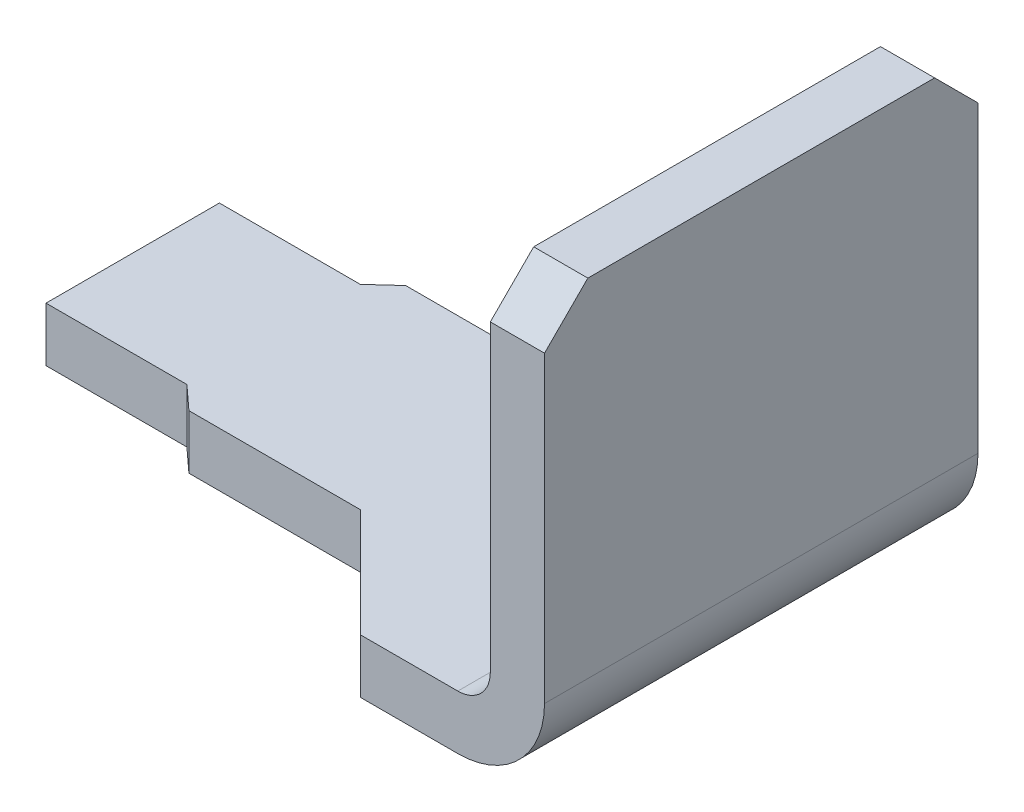
ISO-10303-21;
HEADER;
FILE_DESCRIPTION(('STEP AP214'),'2;1');
FILE_NAME('part.step','',(''),(''),'','','');
FILE_SCHEMA(('AUTOMOTIVE_DESIGN { 1 0 10303 214 1 1 1 1 }'));
ENDSEC;
DATA;
#1=APPLICATION_CONTEXT('core data for automotive mechanical design processes');
#2=APPLICATION_PROTOCOL_DEFINITION('international standard','automotive_design',2000,#1);
#3=PRODUCT_CONTEXT('',#1,'mechanical');
#4=PRODUCT('Part','Part','',(#3));
#5=PRODUCT_RELATED_PRODUCT_CATEGORY('part','',(#4));
#6=PRODUCT_DEFINITION_FORMATION('','',#4);
#7=PRODUCT_DEFINITION_CONTEXT('part definition',#1,'design');
#8=PRODUCT_DEFINITION('design','',#6,#7);
#9=PRODUCT_DEFINITION_SHAPE('','',#8);
#10=(LENGTH_UNIT() NAMED_UNIT(*) SI_UNIT(.MILLI.,.METRE.));
#11=(NAMED_UNIT(*) PLANE_ANGLE_UNIT() SI_UNIT($,.RADIAN.));
#12=(NAMED_UNIT(*) SI_UNIT($,.STERADIAN.) SOLID_ANGLE_UNIT());
#13=UNCERTAINTY_MEASURE_WITH_UNIT(LENGTH_MEASURE(1.E-05),#10,'distance_accuracy_value','');
#14=(GEOMETRIC_REPRESENTATION_CONTEXT(3) GLOBAL_UNCERTAINTY_ASSIGNED_CONTEXT((#13)) GLOBAL_UNIT_ASSIGNED_CONTEXT((#10,
#11,#12)) REPRESENTATION_CONTEXT('',''));
#15=CARTESIAN_POINT('',(0.,0.,0.));
#16=DIRECTION('',(0.,0.,1.));
#17=DIRECTION('',(1.,0.,0.));
#18=AXIS2_PLACEMENT_3D('',#15,#16,#17);
#19=CARTESIAN_POINT('',(9.7,-1.35,-2.84));
#20=DIRECTION('',(0.,-1.,0.));
#21=DIRECTION('',(1.,0.,0.));
#22=AXIS2_PLACEMENT_3D('',#19,#20,#21);
#23=PLANE('',#22);
#24=DIRECTION('',(-1.,0.,0.));
#25=VECTOR('',#24,1.);
#26=CARTESIAN_POINT('',(11.,-1.35,-1.3));
#27=LINE('',#26,#25);
#28=CARTESIAN_POINT('',(10.5094755956487,-1.35,-1.3));
#29=VERTEX_POINT('',#28);
#30=CARTESIAN_POINT('',(11.2999999999995,-1.35,-1.3));
#31=VERTEX_POINT('',#30);
#32=EDGE_CURVE('E210',#29,#31,#27,.F.);
#33=ORIENTED_EDGE('',*,*,#32,.F.);
#34=DIRECTION('',(-0.738337641397567,0.,-0.674431262098279));
#35=VECTOR('',#34,1.);
#36=CARTESIAN_POINT('',(10.53436098737,-1.35,-1.277268548688));
#37=LINE('',#36,#35);
#38=CARTESIAN_POINT('',(10.4000000000019,-1.35,-1.40000000000063));
#39=VERTEX_POINT('',#38);
#40=EDGE_CURVE('E211',#39,#29,#37,.F.);
#41=ORIENTED_EDGE('',*,*,#40,.F.);
#42=DIRECTION('',(-1.,0.,0.));
#43=VECTOR('',#42,1.);
#44=CARTESIAN_POINT('',(11.,-1.35,-1.4));
#45=LINE('',#44,#43);
#46=CARTESIAN_POINT('',(9.75,-1.35,-1.4));
#47=VERTEX_POINT('',#46);
#48=EDGE_CURVE('E212',#47,#39,#45,.F.);
#49=ORIENTED_EDGE('',*,*,#48,.F.);
#50=DIRECTION('',(0.,0.,-1.));
#51=VECTOR('',#50,1.);
#52=CARTESIAN_POINT('',(9.75,-1.35,-1.8));
#53=LINE('',#52,#51);
#54=CARTESIAN_POINT('',(9.75,-1.35,-2.2));
#55=VERTEX_POINT('',#54);
#56=EDGE_CURVE('E218',#55,#47,#53,.F.);
#57=ORIENTED_EDGE('',*,*,#56,.F.);
#58=DIRECTION('',(1.,0.,0.));
#59=VECTOR('',#58,1.);
#60=CARTESIAN_POINT('',(11.,-1.35,-2.2));
#61=LINE('',#60,#59);
#62=CARTESIAN_POINT('',(10.4000000000019,-1.35,-2.19999999999937));
#63=VERTEX_POINT('',#62);
#64=EDGE_CURVE('E168',#63,#55,#61,.F.);
#65=ORIENTED_EDGE('',*,*,#64,.F.);
#66=DIRECTION('',(0.738337641397565,0.,-0.674431262098281));
#67=VECTOR('',#66,1.);
#68=CARTESIAN_POINT('',(10.37511460828,-1.35,-2.177268548688));
#69=LINE('',#68,#67);
#70=CARTESIAN_POINT('',(10.5094755956487,-1.35,-2.3));
#71=VERTEX_POINT('',#70);
#72=EDGE_CURVE('E166',#71,#63,#69,.F.);
#73=ORIENTED_EDGE('',*,*,#72,.F.);
#74=DIRECTION('',(1.,0.,0.));
#75=VECTOR('',#74,1.);
#76=CARTESIAN_POINT('',(11.,-1.35,-2.3));
#77=LINE('',#76,#75);
#78=CARTESIAN_POINT('',(11.2999999999993,-1.35,-2.30000000000023));
#79=VERTEX_POINT('',#78);
#80=EDGE_CURVE('E153',#79,#71,#77,.F.);
#81=ORIENTED_EDGE('',*,*,#80,.F.);
#82=DIRECTION('',(0.707106781187841,0.,-0.707106781185254));
#83=VECTOR('',#82,1.);
#84=CARTESIAN_POINT('',(11.27616723264,-1.35,-2.276167232641));
#85=LINE('',#84,#83);
#86=CARTESIAN_POINT('',(11.8000000000005,-1.35,-2.8));
#87=VERTEX_POINT('',#86);
#88=EDGE_CURVE('E20',#87,#79,#85,.F.);
#89=ORIENTED_EDGE('',*,*,#88,.F.);
#90=DIRECTION('',(1.,0.,0.));
#91=VECTOR('',#90,1.);
#92=CARTESIAN_POINT('',(11.,-1.35,-2.8));
#93=LINE('',#92,#91);
#94=CARTESIAN_POINT('',(12.25,-1.35,-2.8));
#95=VERTEX_POINT('',#94);
#96=EDGE_CURVE('E139',#95,#87,#93,.F.);
#97=ORIENTED_EDGE('',*,*,#96,.F.);
#98=DIRECTION('',(0.,0.,1.));
#99=VECTOR('',#98,1.);
#100=CARTESIAN_POINT('',(12.25,-1.35,-1.8));
#101=LINE('',#100,#99);
#102=CARTESIAN_POINT('',(12.25,-1.35,-0.8));
#103=VERTEX_POINT('',#102);
#104=EDGE_CURVE('E205',#95,#103,#101,.T.);
#105=ORIENTED_EDGE('',*,*,#104,.T.);
#106=DIRECTION('',(-1.,0.,0.));
#107=VECTOR('',#106,1.);
#108=CARTESIAN_POINT('',(11.,-1.35,-0.8));
#109=LINE('',#108,#107);
#110=CARTESIAN_POINT('',(11.8000000000004,-1.35,-0.8));
#111=VERTEX_POINT('',#110);
#112=EDGE_CURVE('E272',#111,#103,#109,.F.);
#113=ORIENTED_EDGE('',*,*,#112,.F.);
#114=DIRECTION('',(-0.707106781187712,0.,-0.707106781185383));
#115=VECTOR('',#114,1.);
#116=CARTESIAN_POINT('',(11.82383276736,-1.35,-0.7761672326408));
#117=LINE('',#116,#115);
#118=EDGE_CURVE('E208',#31,#111,#117,.F.);
#119=ORIENTED_EDGE('',*,*,#118,.F.);
#120=EDGE_LOOP('',(#33,#41,#49,#57,#65,#73,#81,#89,#97,#105,#113,#119));
#121=FACE_BOUND('',#120,.T.);
#122=ADVANCED_FACE('F16',(#121),#23,.T.);
#123=CARTESIAN_POINT('',(12.25,-0.95,-2.8));
#124=DIRECTION('',(0.,0.,1.));
#125=DIRECTION('',(1.,0.,0.));
#126=AXIS2_PLACEMENT_3D('',#123,#124,#125);
#127=CYLINDRICAL_SURFACE('',#126,0.399999999999999);
#128=CARTESIAN_POINT('',(12.25,-0.95,-2.8));
#129=DIRECTION('',(0.,0.,1.));
#130=DIRECTION('',(1.,0.,0.));
#131=AXIS2_PLACEMENT_3D('',#128,#129,#130);
#132=CIRCLE('',#131,0.399999999999999);
#133=CARTESIAN_POINT('',(12.65,-0.95,-2.8));
#134=VERTEX_POINT('',#133);
#135=EDGE_CURVE('E203',#134,#95,#132,.F.);
#136=ORIENTED_EDGE('',*,*,#135,.F.);
#137=DIRECTION('',(0.,0.,-1.));
#138=VECTOR('',#137,1.);
#139=CARTESIAN_POINT('',(12.65,-0.95,-1.8));
#140=LINE('',#139,#138);
#141=CARTESIAN_POINT('',(12.65,-0.95,-0.8));
#142=VERTEX_POINT('',#141);
#143=EDGE_CURVE('E275',#134,#142,#140,.F.);
#144=ORIENTED_EDGE('',*,*,#143,.T.);
#145=CARTESIAN_POINT('',(12.25,-0.95,-0.8));
#146=DIRECTION('',(0.,0.,1.));
#147=DIRECTION('',(1.,0.,0.));
#148=AXIS2_PLACEMENT_3D('',#145,#146,#147);
#149=CIRCLE('',#148,0.399999999999999);
#150=EDGE_CURVE('E206',#103,#142,#149,.T.);
#151=ORIENTED_EDGE('',*,*,#150,.F.);
#152=ORIENTED_EDGE('',*,*,#104,.F.);
#153=EDGE_LOOP('',(#136,#144,#151,#152));
#154=FACE_BOUND('',#153,.T.);
#155=ADVANCED_FACE('F351',(#154),#127,.T.);
#156=CARTESIAN_POINT('',(12.65,-0.9837046228283,-2.84));
#157=DIRECTION('',(1.,0.,0.));
#158=DIRECTION('',(0.,1.,0.));
#159=AXIS2_PLACEMENT_3D('',#156,#157,#158);
#160=PLANE('',#159);
#161=ORIENTED_EDGE('',*,*,#143,.F.);
#162=DIRECTION('',(0.,-1.,0.));
#163=VECTOR('',#162,1.);
#164=CARTESIAN_POINT('',(12.65,-0.45,-2.8));
#165=LINE('',#164,#163);
#166=CARTESIAN_POINT('',(12.65,0.449999999999946,-2.79999999999995));
#167=VERTEX_POINT('',#166);
#168=EDGE_CURVE('E255',#134,#167,#165,.F.);
#169=ORIENTED_EDGE('',*,*,#168,.T.);
#170=DIRECTION('',(0.,-0.707106781187118,-0.707106781185976));
#171=VECTOR('',#170,1.);
#172=CARTESIAN_POINT('',(12.65,0.55,-2.7));
#173=LINE('',#172,#171);
#174=CARTESIAN_POINT('',(12.65,0.65000000000004,-2.60000000000006));
#175=VERTEX_POINT('',#174);
#176=EDGE_CURVE('E257',#167,#175,#173,.F.);
#177=ORIENTED_EDGE('',*,*,#176,.T.);
#178=DIRECTION('',(0.,0.,-1.));
#179=VECTOR('',#178,1.);
#180=CARTESIAN_POINT('',(12.65,0.65,-1.79999999999985));
#181=LINE('',#180,#179);
#182=CARTESIAN_POINT('',(12.65,0.65000000000003,-0.99999999999997));
#183=VERTEX_POINT('',#182);
#184=EDGE_CURVE('E196',#175,#183,#181,.F.);
#185=ORIENTED_EDGE('',*,*,#184,.T.);
#186=DIRECTION('',(0.,0.707106781186833,-0.707106781186262));
#187=VECTOR('',#186,1.);
#188=CARTESIAN_POINT('',(12.65,0.55,-0.8999999999999));
#189=LINE('',#188,#187);
#190=CARTESIAN_POINT('',(12.65,0.450000000000003,-0.799999999999997));
#191=VERTEX_POINT('',#190);
#192=EDGE_CURVE('E329',#183,#191,#189,.F.);
#193=ORIENTED_EDGE('',*,*,#192,.T.);
#194=DIRECTION('',(0.,1.,0.));
#195=VECTOR('',#194,1.);
#196=CARTESIAN_POINT('',(12.65,-0.45,-0.8));
#197=LINE('',#196,#195);
#198=EDGE_CURVE('E268',#191,#142,#197,.F.);
#199=ORIENTED_EDGE('',*,*,#198,.T.);
#200=EDGE_LOOP('',(#161,#169,#177,#185,#193,#199));
#201=FACE_BOUND('',#200,.T.);
#202=ADVANCED_FACE('F354',(#201),#160,.T.);
#203=CARTESIAN_POINT('',(12.68370462283,0.6738327673592,-1.023832767359));
#204=DIRECTION('',(0.,0.707106781186262,0.707106781186833));
#205=DIRECTION('',(-1.,0.,0.));
#206=AXIS2_PLACEMENT_3D('',#203,#204,#205);
#207=PLANE('',#206);
#208=ORIENTED_EDGE('',*,*,#192,.F.);
#209=DIRECTION('',(1.,0.,0.));
#210=VECTOR('',#209,1.);
#211=CARTESIAN_POINT('',(12.525,0.65,-1.));
#212=LINE('',#211,#210);
#213=CARTESIAN_POINT('',(12.4,0.65,-0.999999999999909));
#214=VERTEX_POINT('',#213);
#215=EDGE_CURVE('E319',#183,#214,#212,.F.);
#216=ORIENTED_EDGE('',*,*,#215,.T.);
#217=DIRECTION('',(0.,-0.707106781186833,0.707106781186262));
#218=VECTOR('',#217,1.);
#219=CARTESIAN_POINT('',(12.4,0.6738327673592,-1.023832767359));
#220=LINE('',#219,#218);
#221=CARTESIAN_POINT('',(12.4,0.45000000000001,-0.8));
#222=VERTEX_POINT('',#221);
#223=EDGE_CURVE('E193',#214,#222,#220,.T.);
#224=ORIENTED_EDGE('',*,*,#223,.T.);
#225=DIRECTION('',(-1.,0.,0.));
#226=VECTOR('',#225,1.);
#227=CARTESIAN_POINT('',(12.225,0.45,-0.8));
#228=LINE('',#227,#226);
#229=EDGE_CURVE('E304',#222,#191,#228,.F.);
#230=ORIENTED_EDGE('',*,*,#229,.T.);
#231=EDGE_LOOP('',(#208,#216,#224,#230));
#232=FACE_BOUND('',#231,.T.);
#233=ADVANCED_FACE('F358',(#232),#207,.T.);
#234=CARTESIAN_POINT('',(12.68370462283,0.486,-0.8));
#235=DIRECTION('',(0.,0.,1.));
#236=DIRECTION('',(-1.,0.,0.));
#237=AXIS2_PLACEMENT_3D('',#234,#235,#236);
#238=PLANE('',#237);
#239=CARTESIAN_POINT('',(12.25,-0.95,-0.8));
#240=DIRECTION('',(0.,0.,1.));
#241=DIRECTION('',(1.,0.,0.));
#242=AXIS2_PLACEMENT_3D('',#239,#240,#241);
#243=CIRCLE('',#242,0.150000000000003);
#244=CARTESIAN_POINT('',(12.25,-1.1,-0.8));
#245=VERTEX_POINT('',#244);
#246=CARTESIAN_POINT('',(12.4,-0.95,-0.8));
#247=VERTEX_POINT('',#246);
#248=EDGE_CURVE('E200',#245,#247,#243,.T.);
#249=ORIENTED_EDGE('',*,*,#248,.F.);
#250=DIRECTION('',(-1.,0.,0.));
#251=VECTOR('',#250,1.);
#252=CARTESIAN_POINT('',(12.225,-1.1,-0.8));
#253=LINE('',#252,#251);
#254=CARTESIAN_POINT('',(11.8000000000001,-1.1,-0.800000000000121));
#255=VERTEX_POINT('',#254);
#256=EDGE_CURVE('E202',#255,#245,#253,.F.);
#257=ORIENTED_EDGE('',*,*,#256,.F.);
#258=DIRECTION('',(0.,-1.,0.));
#259=VECTOR('',#258,1.);
#260=CARTESIAN_POINT('',(11.8,-0.45,-0.8));
#261=LINE('',#260,#259);
#262=EDGE_CURVE('E266',#111,#255,#261,.F.);
#263=ORIENTED_EDGE('',*,*,#262,.F.);
#264=ORIENTED_EDGE('',*,*,#112,.T.);
#265=ORIENTED_EDGE('',*,*,#150,.T.);
#266=ORIENTED_EDGE('',*,*,#198,.F.);
#267=ORIENTED_EDGE('',*,*,#229,.F.);
#268=DIRECTION('',(0.,1.,0.));
#269=VECTOR('',#268,1.);
#270=CARTESIAN_POINT('',(12.4,-0.15,-0.8));
#271=LINE('',#270,#269);
#272=EDGE_CURVE('E195',#222,#247,#271,.F.);
#273=ORIENTED_EDGE('',*,*,#272,.T.);
#274=EDGE_LOOP('',(#249,#257,#263,#264,#265,#266,#267,#273));
#275=FACE_BOUND('',#274,.T.);
#276=ADVANCED_FACE('F290',(#275),#238,.T.);
#277=CARTESIAN_POINT('',(11.76629537717,0.486,-2.8));
#278=DIRECTION('',(0.,0.,-1.));
#279=DIRECTION('',(1.,0.,0.));
#280=AXIS2_PLACEMENT_3D('',#277,#278,#279);
#281=PLANE('',#280);
#282=ORIENTED_EDGE('',*,*,#135,.T.);
#283=ORIENTED_EDGE('',*,*,#96,.T.);
#284=DIRECTION('',(0.,1.,0.));
#285=VECTOR('',#284,1.);
#286=CARTESIAN_POINT('',(11.8,-0.45,-2.8));
#287=LINE('',#286,#285);
#288=CARTESIAN_POINT('',(11.8000000000005,-1.1,-2.8));
#289=VERTEX_POINT('',#288);
#290=EDGE_CURVE('E150',#289,#87,#287,.F.);
#291=ORIENTED_EDGE('',*,*,#290,.F.);
#292=DIRECTION('',(1.,0.,0.));
#293=VECTOR('',#292,1.);
#294=CARTESIAN_POINT('',(12.225,-1.1,-2.8));
#295=LINE('',#294,#293);
#296=CARTESIAN_POINT('',(12.25,-1.1,-2.8));
#297=VERTEX_POINT('',#296);
#298=EDGE_CURVE('E199',#297,#289,#295,.F.);
#299=ORIENTED_EDGE('',*,*,#298,.F.);
#300=CARTESIAN_POINT('',(12.25,-0.95,-2.8));
#301=DIRECTION('',(0.,0.,1.));
#302=DIRECTION('',(1.,0.,0.));
#303=AXIS2_PLACEMENT_3D('',#300,#301,#302);
#304=CIRCLE('',#303,0.150000000000003);
#305=CARTESIAN_POINT('',(12.4,-0.95,-2.8));
#306=VERTEX_POINT('',#305);
#307=EDGE_CURVE('E197',#306,#297,#304,.F.);
#308=ORIENTED_EDGE('',*,*,#307,.F.);
#309=DIRECTION('',(0.,-1.,0.));
#310=VECTOR('',#309,1.);
#311=CARTESIAN_POINT('',(12.4,-0.15,-2.8));
#312=LINE('',#311,#310);
#313=CARTESIAN_POINT('',(12.4,0.449999999999879,-2.79999999999996));
#314=VERTEX_POINT('',#313);
#315=EDGE_CURVE('E192',#306,#314,#312,.F.);
#316=ORIENTED_EDGE('',*,*,#315,.T.);
#317=DIRECTION('',(-1.,0.,0.));
#318=VECTOR('',#317,1.);
#319=CARTESIAN_POINT('',(12.525,0.44999999999992,-2.79999999999992));
#320=LINE('',#319,#318);
#321=EDGE_CURVE('E316',#314,#167,#320,.F.);
#322=ORIENTED_EDGE('',*,*,#321,.T.);
#323=ORIENTED_EDGE('',*,*,#168,.F.);
#324=EDGE_LOOP('',(#282,#283,#291,#299,#308,#316,#322,#323));
#325=FACE_BOUND('',#324,.T.);
#326=ADVANCED_FACE('F254',(#325),#281,.T.);
#327=CARTESIAN_POINT('',(12.68370462283,0.4261672326408,-2.823832767359));
#328=DIRECTION('',(0.,0.707106781185977,-0.707106781187119));
#329=DIRECTION('',(-1.,0.,0.));
#330=AXIS2_PLACEMENT_3D('',#327,#328,#329);
#331=PLANE('',#330);
#332=DIRECTION('',(0.,0.707106781187119,0.707106781185977));
#333=VECTOR('',#332,1.);
#334=CARTESIAN_POINT('',(12.4,0.4261672326408,-2.823832767359));
#335=LINE('',#334,#333);
#336=CARTESIAN_POINT('',(12.4,0.65,-2.60000000000008));
#337=VERTEX_POINT('',#336);
#338=EDGE_CURVE('E189',#314,#337,#335,.T.);
#339=ORIENTED_EDGE('',*,*,#338,.T.);
#340=DIRECTION('',(-1.,0.,0.));
#341=VECTOR('',#340,1.);
#342=CARTESIAN_POINT('',(12.525,0.65,-2.6));
#343=LINE('',#342,#341);
#344=EDGE_CURVE('E333',#337,#175,#343,.F.);
#345=ORIENTED_EDGE('',*,*,#344,.T.);
#346=ORIENTED_EDGE('',*,*,#176,.F.);
#347=ORIENTED_EDGE('',*,*,#321,.F.);
#348=EDGE_LOOP('',(#339,#345,#346,#347));
#349=FACE_BOUND('',#348,.T.);
#350=ADVANCED_FACE('F365',(#349),#331,.T.);
#351=CARTESIAN_POINT('',(12.68370462283,0.65,-2.633704622828));
#352=DIRECTION('',(0.,1.,0.));
#353=DIRECTION('',(-1.,0.,0.));
#354=AXIS2_PLACEMENT_3D('',#351,#352,#353);
#355=PLANE('',#354);
#356=ORIENTED_EDGE('',*,*,#344,.F.);
#357=DIRECTION('',(0.,0.,-1.));
#358=VECTOR('',#357,1.);
#359=CARTESIAN_POINT('',(12.4,0.65,-1.8));
#360=LINE('',#359,#358);
#361=EDGE_CURVE('E191',#337,#214,#360,.F.);
#362=ORIENTED_EDGE('',*,*,#361,.T.);
#363=ORIENTED_EDGE('',*,*,#215,.F.);
#364=ORIENTED_EDGE('',*,*,#184,.F.);
#365=EDGE_LOOP('',(#356,#362,#363,#364));
#366=FACE_BOUND('',#365,.T.);
#367=ADVANCED_FACE('F362',(#366),#355,.T.);
#368=CARTESIAN_POINT('',(12.4,0.6837046228283,-2.84));
#369=DIRECTION('',(-1.,0.,0.));
#370=DIRECTION('',(0.,-1.,0.));
#371=AXIS2_PLACEMENT_3D('',#368,#369,#370);
#372=PLANE('',#371);
#373=ORIENTED_EDGE('',*,*,#338,.F.);
#374=ORIENTED_EDGE('',*,*,#315,.F.);
#375=DIRECTION('',(0.,0.,-1.));
#376=VECTOR('',#375,1.);
#377=CARTESIAN_POINT('',(12.4,-0.95,-1.8));
#378=LINE('',#377,#376);
#379=EDGE_CURVE('E232',#306,#247,#378,.F.);
#380=ORIENTED_EDGE('',*,*,#379,.T.);
#381=ORIENTED_EDGE('',*,*,#272,.F.);
#382=ORIENTED_EDGE('',*,*,#223,.F.);
#383=ORIENTED_EDGE('',*,*,#361,.F.);
#384=EDGE_LOOP('',(#373,#374,#380,#381,#382,#383));
#385=FACE_BOUND('',#384,.T.);
#386=ADVANCED_FACE('F310',(#385),#372,.T.);
#387=CARTESIAN_POINT('',(12.25,-0.95,-2.8));
#388=DIRECTION('',(0.,0.,1.));
#389=DIRECTION('',(1.,0.,0.));
#390=AXIS2_PLACEMENT_3D('',#387,#388,#389);
#391=CYLINDRICAL_SURFACE('',#390,0.150000000000003);
#392=ORIENTED_EDGE('',*,*,#307,.T.);
#393=DIRECTION('',(0.,0.,1.));
#394=VECTOR('',#393,1.);
#395=CARTESIAN_POINT('',(12.25,-1.1,-1.8));
#396=LINE('',#395,#394);
#397=EDGE_CURVE('E188',#297,#245,#396,.T.);
#398=ORIENTED_EDGE('',*,*,#397,.T.);
#399=ORIENTED_EDGE('',*,*,#248,.T.);
#400=ORIENTED_EDGE('',*,*,#379,.F.);
#401=EDGE_LOOP('',(#392,#398,#399,#400));
#402=FACE_BOUND('',#401,.T.);
#403=ADVANCED_FACE('F297',(#402),#391,.F.);
#404=CARTESIAN_POINT('',(10.43370462283,-1.066295377172,-1.4));
#405=DIRECTION('',(0.,0.,1.));
#406=DIRECTION('',(-1.,0.,0.));
#407=AXIS2_PLACEMENT_3D('',#404,#405,#406);
#408=PLANE('',#407);
#409=DIRECTION('',(-1.,0.,0.));
#410=VECTOR('',#409,1.);
#411=CARTESIAN_POINT('',(11.,-1.1,-1.4));
#412=LINE('',#411,#410);
#413=CARTESIAN_POINT('',(10.4000000000019,-1.1,-1.40000000000063));
#414=VERTEX_POINT('',#413);
#415=CARTESIAN_POINT('',(9.75,-1.1,-1.4));
#416=VERTEX_POINT('',#415);
#417=EDGE_CURVE('E180',#414,#416,#412,.T.);
#418=ORIENTED_EDGE('',*,*,#417,.T.);
#419=DIRECTION('',(0.,1.,0.));
#420=VECTOR('',#419,1.);
#421=CARTESIAN_POINT('',(9.75,-1.225,-1.4));
#422=LINE('',#421,#420);
#423=EDGE_CURVE('E229',#416,#47,#422,.F.);
#424=ORIENTED_EDGE('',*,*,#423,.T.);
#425=ORIENTED_EDGE('',*,*,#48,.T.);
#426=DIRECTION('',(0.,-1.,0.));
#427=VECTOR('',#426,1.);
#428=CARTESIAN_POINT('',(10.4000000000012,-1.225,-1.40000000000127));
#429=LINE('',#428,#427);
#430=EDGE_CURVE('E160',#39,#414,#429,.F.);
#431=ORIENTED_EDGE('',*,*,#430,.T.);
#432=EDGE_LOOP('',(#418,#424,#425,#431));
#433=FACE_BOUND('',#432,.T.);
#434=ADVANCED_FACE('F399',(#433),#408,.T.);
#435=CARTESIAN_POINT('',(9.75,-1.066295377172,-1.366295377172));
#436=DIRECTION('',(-1.,0.,0.));
#437=DIRECTION('',(0.,0.,-1.));
#438=AXIS2_PLACEMENT_3D('',#435,#436,#437);
#439=PLANE('',#438);
#440=DIRECTION('',(0.,0.,-1.));
#441=VECTOR('',#440,1.);
#442=CARTESIAN_POINT('',(9.75,-1.1,-1.8));
#443=LINE('',#442,#441);
#444=CARTESIAN_POINT('',(9.75,-1.1,-2.2));
#445=VERTEX_POINT('',#444);
#446=EDGE_CURVE('E175',#416,#445,#443,.T.);
#447=ORIENTED_EDGE('',*,*,#446,.T.);
#448=DIRECTION('',(0.,1.,0.));
#449=VECTOR('',#448,1.);
#450=CARTESIAN_POINT('',(9.75,-1.225,-2.2));
#451=LINE('',#450,#449);
#452=EDGE_CURVE('E231',#445,#55,#451,.F.);
#453=ORIENTED_EDGE('',*,*,#452,.T.);
#454=ORIENTED_EDGE('',*,*,#56,.T.);
#455=ORIENTED_EDGE('',*,*,#423,.F.);
#456=EDGE_LOOP('',(#447,#453,#454,#455));
#457=FACE_BOUND('',#456,.T.);
#458=ADVANCED_FACE('F396',(#457),#439,.T.);
#459=CARTESIAN_POINT('',(9.716295377172,-1.066295377172,-2.2));
#460=DIRECTION('',(0.,0.,-1.));
#461=DIRECTION('',(1.,0.,0.));
#462=AXIS2_PLACEMENT_3D('',#459,#460,#461);
#463=PLANE('',#462);
#464=DIRECTION('',(1.,0.,0.));
#465=VECTOR('',#464,1.);
#466=CARTESIAN_POINT('',(11.,-1.1,-2.2));
#467=LINE('',#466,#465);
#468=CARTESIAN_POINT('',(10.4000000000019,-1.1,-2.19999999999937));
#469=VERTEX_POINT('',#468);
#470=EDGE_CURVE('E172',#445,#469,#467,.T.);
#471=ORIENTED_EDGE('',*,*,#470,.T.);
#472=DIRECTION('',(0.,1.,0.));
#473=VECTOR('',#472,1.);
#474=CARTESIAN_POINT('',(10.4000000000012,-1.225,-2.19999999999873));
#475=LINE('',#474,#473);
#476=EDGE_CURVE('E239',#469,#63,#475,.F.);
#477=ORIENTED_EDGE('',*,*,#476,.T.);
#478=ORIENTED_EDGE('',*,*,#64,.T.);
#479=ORIENTED_EDGE('',*,*,#452,.F.);
#480=EDGE_LOOP('',(#471,#477,#478,#479));
#481=FACE_BOUND('',#480,.T.);
#482=ADVANCED_FACE('F393',(#481),#463,.T.);
#483=CARTESIAN_POINT('',(10.37511460828,-1.066295377172,-2.177268548688));
#484=DIRECTION('',(-0.674431262098281,0.,-0.738337641397565));
#485=DIRECTION('',(0.738337641397565,0.,-0.674431262098281));
#486=AXIS2_PLACEMENT_3D('',#483,#484,#485);
#487=PLANE('',#486);
#488=DIRECTION('',(0.738337641397565,0.,-0.674431262098281));
#489=VECTOR('',#488,1.);
#490=CARTESIAN_POINT('',(10.37511460828,-1.1,-2.177268548688));
#491=LINE('',#490,#489);
#492=CARTESIAN_POINT('',(10.5094755956487,-1.1,-2.3));
#493=VERTEX_POINT('',#492);
#494=EDGE_CURVE('E174',#469,#493,#491,.T.);
#495=ORIENTED_EDGE('',*,*,#494,.T.);
#496=DIRECTION('',(0.,1.,0.));
#497=VECTOR('',#496,1.);
#498=CARTESIAN_POINT('',(10.50947559565,-1.225,-2.3));
#499=LINE('',#498,#497);
#500=EDGE_CURVE('E161',#493,#71,#499,.F.);
#501=ORIENTED_EDGE('',*,*,#500,.T.);
#502=ORIENTED_EDGE('',*,*,#72,.T.);
#503=ORIENTED_EDGE('',*,*,#476,.F.);
#504=EDGE_LOOP('',(#495,#501,#502,#503));
#505=FACE_BOUND('',#504,.T.);
#506=ADVANCED_FACE('F248',(#505),#487,.T.);
#507=CARTESIAN_POINT('',(10.47577097282,-1.066295377172,-2.3));
#508=DIRECTION('',(0.,0.,-1.));
#509=DIRECTION('',(1.,0.,0.));
#510=AXIS2_PLACEMENT_3D('',#507,#508,#509);
#511=PLANE('',#510);
#512=DIRECTION('',(1.,0.,0.));
#513=VECTOR('',#512,1.);
#514=CARTESIAN_POINT('',(11.,-1.1,-2.3));
#515=LINE('',#514,#513);
#516=CARTESIAN_POINT('',(11.2999999999993,-1.1,-2.30000000000023));
#517=VERTEX_POINT('',#516);
#518=EDGE_CURVE('E159',#493,#517,#515,.T.);
#519=ORIENTED_EDGE('',*,*,#518,.T.);
#520=DIRECTION('',(0.,1.,0.));
#521=VECTOR('',#520,1.);
#522=CARTESIAN_POINT('',(11.2999999999995,-1.225,-2.30000000000046));
#523=LINE('',#522,#521);
#524=EDGE_CURVE('E148',#517,#79,#523,.F.);
#525=ORIENTED_EDGE('',*,*,#524,.T.);
#526=ORIENTED_EDGE('',*,*,#80,.T.);
#527=ORIENTED_EDGE('',*,*,#500,.F.);
#528=EDGE_LOOP('',(#519,#525,#526,#527));
#529=FACE_BOUND('',#528,.T.);
#530=ADVANCED_FACE('F155',(#529),#511,.T.);
#531=CARTESIAN_POINT('',(11.27616723264,-1.066295377172,-2.276167232641));
#532=DIRECTION('',(-0.707106781185254,0.,-0.707106781187841));
#533=DIRECTION('',(0.707106781187841,0.,-0.707106781185254));
#534=AXIS2_PLACEMENT_3D('',#531,#532,#533);
#535=PLANE('',#534);
#536=DIRECTION('',(0.707106781187841,0.,-0.707106781185254));
#537=VECTOR('',#536,1.);
#538=CARTESIAN_POINT('',(11.27616723264,-1.1,-2.276167232641));
#539=LINE('',#538,#537);
#540=EDGE_CURVE('E177',#517,#289,#539,.T.);
#541=ORIENTED_EDGE('',*,*,#540,.T.);
#542=ORIENTED_EDGE('',*,*,#290,.T.);
#543=ORIENTED_EDGE('',*,*,#88,.T.);
#544=ORIENTED_EDGE('',*,*,#524,.F.);
#545=EDGE_LOOP('',(#541,#542,#543,#544));
#546=FACE_BOUND('',#545,.T.);
#547=ADVANCED_FACE('F147',(#546),#535,.T.);
#548=CARTESIAN_POINT('',(10.53436098737,-1.066295377172,-1.277268548688));
#549=DIRECTION('',(-0.674431262098279,0.,0.738337641397567));
#550=DIRECTION('',(-0.738337641397567,0.,-0.674431262098279));
#551=AXIS2_PLACEMENT_3D('',#548,#549,#550);
#552=PLANE('',#551);
#553=DIRECTION('',(-0.738337641397567,0.,-0.674431262098279));
#554=VECTOR('',#553,1.);
#555=CARTESIAN_POINT('',(10.53436098737,-1.1,-1.277268548688));
#556=LINE('',#555,#554);
#557=CARTESIAN_POINT('',(10.5094755956487,-1.1,-1.3));
#558=VERTEX_POINT('',#557);
#559=EDGE_CURVE('E182',#558,#414,#556,.T.);
#560=ORIENTED_EDGE('',*,*,#559,.T.);
#561=ORIENTED_EDGE('',*,*,#430,.F.);
#562=ORIENTED_EDGE('',*,*,#40,.T.);
#563=DIRECTION('',(0.,-1.,0.));
#564=VECTOR('',#563,1.);
#565=CARTESIAN_POINT('',(10.50947559565,-1.225,-1.3));
#566=LINE('',#565,#564);
#567=EDGE_CURVE('E179',#29,#558,#566,.F.);
#568=ORIENTED_EDGE('',*,*,#567,.T.);
#569=EDGE_LOOP('',(#560,#561,#562,#568));
#570=FACE_BOUND('',#569,.T.);
#571=ADVANCED_FACE('F276',(#570),#552,.T.);
#572=CARTESIAN_POINT('',(9.7,-1.1,-2.84));
#573=DIRECTION('',(0.,-1.,0.));
#574=DIRECTION('',(1.,0.,0.));
#575=AXIS2_PLACEMENT_3D('',#572,#573,#574);
#576=PLANE('',#575);
#577=ORIENTED_EDGE('',*,*,#518,.F.);
#578=ORIENTED_EDGE('',*,*,#494,.F.);
#579=ORIENTED_EDGE('',*,*,#470,.F.);
#580=ORIENTED_EDGE('',*,*,#446,.F.);
#581=ORIENTED_EDGE('',*,*,#417,.F.);
#582=ORIENTED_EDGE('',*,*,#559,.F.);
#583=DIRECTION('',(-1.,0.,0.));
#584=VECTOR('',#583,1.);
#585=CARTESIAN_POINT('',(10.904737797825,-1.1,-1.3));
#586=LINE('',#585,#584);
#587=CARTESIAN_POINT('',(11.2999999999999,-1.1,-1.29999999999988));
#588=VERTEX_POINT('',#587);
#589=EDGE_CURVE('E26',#558,#588,#586,.F.);
#590=ORIENTED_EDGE('',*,*,#589,.T.);
#591=DIRECTION('',(-0.707106781187712,0.,-0.707106781185383));
#592=VECTOR('',#591,1.);
#593=CARTESIAN_POINT('',(11.55,-1.1,-1.0499999999999));
#594=LINE('',#593,#592);
#595=EDGE_CURVE('E184',#588,#255,#594,.F.);
#596=ORIENTED_EDGE('',*,*,#595,.T.);
#597=ORIENTED_EDGE('',*,*,#256,.T.);
#598=ORIENTED_EDGE('',*,*,#397,.F.);
#599=ORIENTED_EDGE('',*,*,#298,.T.);
#600=ORIENTED_EDGE('',*,*,#540,.F.);
#601=EDGE_LOOP('',(#577,#578,#579,#580,#581,#582,#590,#596,#597,#598,#599,#600));
#602=FACE_BOUND('',#601,.T.);
#603=ADVANCED_FACE('F250',(#602),#576,.F.);
#604=CARTESIAN_POINT('',(11.82383276736,-1.066295377172,-0.7761672326408));
#605=DIRECTION('',(-0.707106781185383,0.,0.707106781187712));
#606=DIRECTION('',(-0.707106781187712,0.,-0.707106781185383));
#607=AXIS2_PLACEMENT_3D('',#604,#605,#606);
#608=PLANE('',#607);
#609=ORIENTED_EDGE('',*,*,#595,.F.);
#610=DIRECTION('',(0.,1.,0.));
#611=VECTOR('',#610,1.);
#612=CARTESIAN_POINT('',(11.3,-1.225,-1.3));
#613=LINE('',#612,#611);
#614=EDGE_CURVE('E10',#588,#31,#613,.F.);
#615=ORIENTED_EDGE('',*,*,#614,.T.);
#616=ORIENTED_EDGE('',*,*,#118,.T.);
#617=ORIENTED_EDGE('',*,*,#262,.T.);
#618=EDGE_LOOP('',(#609,#615,#616,#617));
#619=FACE_BOUND('',#618,.T.);
#620=ADVANCED_FACE('F283',(#619),#608,.T.);
#621=CARTESIAN_POINT('',(11.33370462283,-1.066295377172,-1.3));
#622=DIRECTION('',(0.,0.,1.));
#623=DIRECTION('',(-1.,0.,0.));
#624=AXIS2_PLACEMENT_3D('',#621,#622,#623);
#625=PLANE('',#624);
#626=ORIENTED_EDGE('',*,*,#589,.F.);
#627=ORIENTED_EDGE('',*,*,#567,.F.);
#628=ORIENTED_EDGE('',*,*,#32,.T.);
#629=ORIENTED_EDGE('',*,*,#614,.F.);
#630=EDGE_LOOP('',(#626,#627,#628,#629));
#631=FACE_BOUND('',#630,.T.);
#632=ADVANCED_FACE('F18',(#631),#625,.T.);
#633=CLOSED_SHELL('',(#122,#155,#202,#233,#276,#326,#350,#367,#386,#403,#434,#458,#482,#506,
#530,#547,#571,#603,#620,#632));
#634=MANIFOLD_SOLID_BREP('B1',#633);
#635=ADVANCED_BREP_SHAPE_REPRESENTATION('',(#18,#634),#14);
#636=SHAPE_DEFINITION_REPRESENTATION(#9,#635);
ENDSEC;
END-ISO-10303-21;
